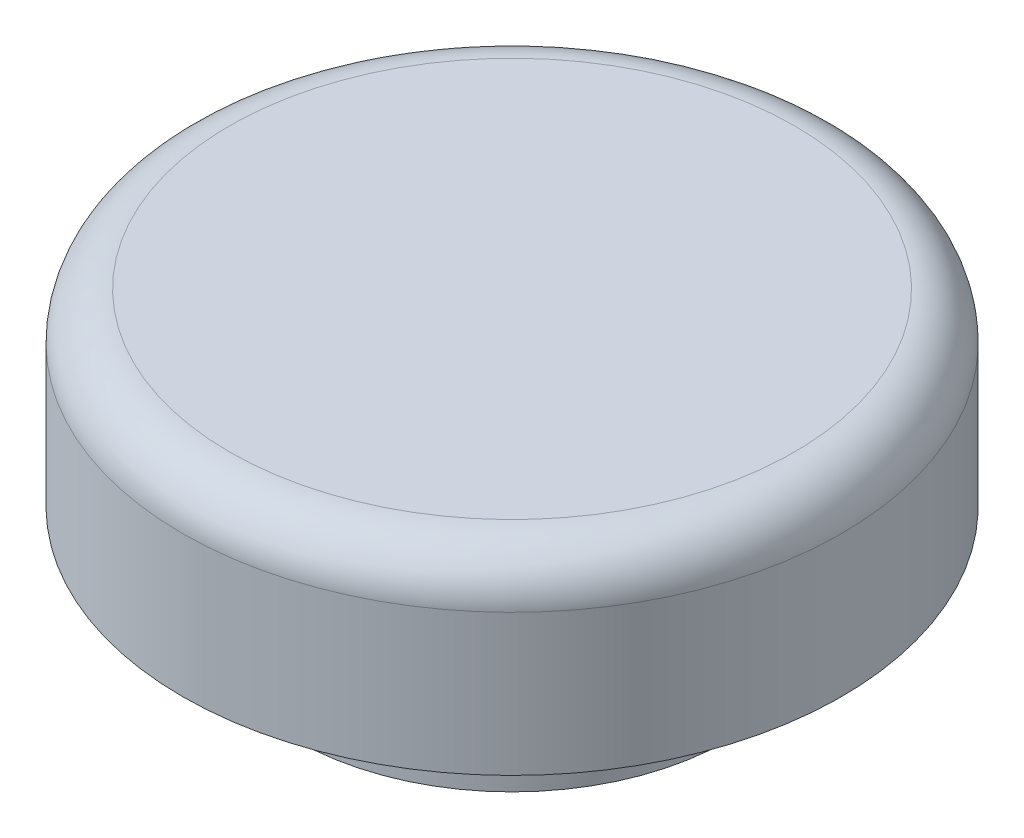
ISO-10303-21;
HEADER;
FILE_DESCRIPTION(('STEP AP214'),'2;1');
FILE_NAME('part.step','',(''),(''),'','','');
FILE_SCHEMA(('AUTOMOTIVE_DESIGN { 1 0 10303 214 1 1 1 1 }'));
ENDSEC;
DATA;
#1=APPLICATION_CONTEXT('core data for automotive mechanical design processes');
#2=APPLICATION_PROTOCOL_DEFINITION('international standard','automotive_design',2000,#1);
#3=PRODUCT_CONTEXT('',#1,'mechanical');
#4=PRODUCT('Part','Part','',(#3));
#5=PRODUCT_RELATED_PRODUCT_CATEGORY('part','',(#4));
#6=PRODUCT_DEFINITION_FORMATION('','',#4);
#7=PRODUCT_DEFINITION_CONTEXT('part definition',#1,'design');
#8=PRODUCT_DEFINITION('design','',#6,#7);
#9=PRODUCT_DEFINITION_SHAPE('','',#8);
#10=(LENGTH_UNIT() NAMED_UNIT(*) SI_UNIT(.MILLI.,.METRE.));
#11=(NAMED_UNIT(*) PLANE_ANGLE_UNIT() SI_UNIT($,.RADIAN.));
#12=(NAMED_UNIT(*) SI_UNIT($,.STERADIAN.) SOLID_ANGLE_UNIT());
#13=UNCERTAINTY_MEASURE_WITH_UNIT(LENGTH_MEASURE(1.E-05),#10,'distance_accuracy_value','');
#14=(GEOMETRIC_REPRESENTATION_CONTEXT(3) GLOBAL_UNCERTAINTY_ASSIGNED_CONTEXT((#13)) GLOBAL_UNIT_ASSIGNED_CONTEXT((#10,
#11,#12)) REPRESENTATION_CONTEXT('',''));
#15=CARTESIAN_POINT('',(0.,0.,0.));
#16=DIRECTION('',(0.,0.,1.));
#17=DIRECTION('',(1.,0.,0.));
#18=AXIS2_PLACEMENT_3D('',#15,#16,#17);
#19=CARTESIAN_POINT('',(0.,1.,0.));
#20=DIRECTION('',(0.,-1.,0.));
#21=DIRECTION('',(0.,0.,-1.));
#22=AXIS2_PLACEMENT_3D('',#19,#20,#21);
#23=CYLINDRICAL_SURFACE('',#22,2.3);
#24=CARTESIAN_POINT('',(0.,1.,0.));
#25=DIRECTION('',(0.,1.,0.));
#26=DIRECTION('',(0.,0.,1.));
#27=AXIS2_PLACEMENT_3D('',#24,#25,#26);
#28=CIRCLE('',#27,2.3);
#29=CARTESIAN_POINT('',(0.,1.,2.3));
#30=VERTEX_POINT('',#29);
#31=EDGE_CURVE('E44',#30,#30,#28,.T.);
#32=ORIENTED_EDGE('',*,*,#31,.F.);
#33=EDGE_LOOP('',(#32));
#34=FACE_BOUND('',#33,.T.);
#35=CARTESIAN_POINT('',(0.,0.,0.));
#36=DIRECTION('',(0.,1.,0.));
#37=DIRECTION('',(0.,0.,1.));
#38=AXIS2_PLACEMENT_3D('',#35,#36,#37);
#39=CIRCLE('',#38,2.3);
#40=CARTESIAN_POINT('',(0.,0.,2.3));
#41=VERTEX_POINT('',#40);
#42=EDGE_CURVE('E48',#41,#41,#39,.T.);
#43=ORIENTED_EDGE('',*,*,#42,.T.);
#44=EDGE_LOOP('',(#43));
#45=FACE_BOUND('',#44,.T.);
#46=ADVANCED_FACE('F33',(#34,#45),#23,.T.);
#47=CARTESIAN_POINT('',(0.,0.,0.));
#48=DIRECTION('',(0.,1.,0.));
#49=DIRECTION('',(0.,0.,1.));
#50=AXIS2_PLACEMENT_3D('',#47,#48,#49);
#51=PLANE('',#50);
#52=ORIENTED_EDGE('',*,*,#42,.F.);
#53=EDGE_LOOP('',(#52));
#54=FACE_BOUND('',#53,.T.);
#55=ADVANCED_FACE('F72',(#54),#51,.F.);
#56=CARTESIAN_POINT('',(0.,3.,0.));
#57=DIRECTION('',(0.,-1.,0.));
#58=DIRECTION('',(0.,0.,-1.));
#59=AXIS2_PLACEMENT_3D('',#56,#57,#58);
#60=CYLINDRICAL_SURFACE('',#59,3.5);
#61=CARTESIAN_POINT('',(0.,2.5,0.));
#62=DIRECTION('',(0.,1.,0.));
#63=DIRECTION('',(0.,0.,1.));
#64=AXIS2_PLACEMENT_3D('',#61,#62,#63);
#65=CIRCLE('',#64,3.5);
#66=CARTESIAN_POINT('',(0.,2.5,3.5));
#67=VERTEX_POINT('',#66);
#68=EDGE_CURVE('E10',#67,#67,#65,.F.);
#69=ORIENTED_EDGE('',*,*,#68,.T.);
#70=EDGE_LOOP('',(#69));
#71=FACE_BOUND('',#70,.T.);
#72=CARTESIAN_POINT('',(0.,1.,0.));
#73=DIRECTION('',(0.,1.,0.));
#74=DIRECTION('',(0.,0.,1.));
#75=AXIS2_PLACEMENT_3D('',#72,#73,#74);
#76=CIRCLE('',#75,3.5);
#77=CARTESIAN_POINT('',(0.,1.,3.5));
#78=VERTEX_POINT('',#77);
#79=EDGE_CURVE('E52',#78,#78,#76,.T.);
#80=ORIENTED_EDGE('',*,*,#79,.T.);
#81=EDGE_LOOP('',(#80));
#82=FACE_BOUND('',#81,.T.);
#83=ADVANCED_FACE('F57',(#71,#82),#60,.T.);
#84=CARTESIAN_POINT('',(0.,3.,0.));
#85=DIRECTION('',(0.,1.,0.));
#86=DIRECTION('',(0.,0.,1.));
#87=AXIS2_PLACEMENT_3D('',#84,#85,#86);
#88=PLANE('',#87);
#89=CARTESIAN_POINT('',(0.,3.,0.));
#90=DIRECTION('',(0.,1.,0.));
#91=DIRECTION('',(0.,0.,1.));
#92=AXIS2_PLACEMENT_3D('',#89,#90,#91);
#93=CIRCLE('',#92,3.);
#94=CARTESIAN_POINT('',(0.,3.,3.));
#95=VERTEX_POINT('',#94);
#96=EDGE_CURVE('E40',#95,#95,#93,.T.);
#97=ORIENTED_EDGE('',*,*,#96,.T.);
#98=EDGE_LOOP('',(#97));
#99=FACE_BOUND('',#98,.T.);
#100=ADVANCED_FACE('F61',(#99),#88,.T.);
#101=CARTESIAN_POINT('',(0.,1.,0.));
#102=DIRECTION('',(0.,1.,0.));
#103=DIRECTION('',(0.,0.,1.));
#104=AXIS2_PLACEMENT_3D('',#101,#102,#103);
#105=PLANE('',#104);
#106=ORIENTED_EDGE('',*,*,#31,.T.);
#107=EDGE_LOOP('',(#106));
#108=FACE_BOUND('',#107,.T.);
#109=ORIENTED_EDGE('',*,*,#79,.F.);
#110=EDGE_LOOP('',(#109));
#111=FACE_BOUND('',#110,.T.);
#112=ADVANCED_FACE('F59',(#108,#111),#105,.F.);
#113=CARTESIAN_POINT('',(0.,2.5,0.));
#114=DIRECTION('',(0.,1.,0.));
#115=DIRECTION('',(0.,0.,1.));
#116=AXIS2_PLACEMENT_3D('',#113,#114,#115);
#117=TOROIDAL_SURFACE('',#116,3.,0.5);
#118=ORIENTED_EDGE('',*,*,#68,.F.);
#119=EDGE_LOOP('',(#118));
#120=FACE_BOUND('',#119,.T.);
#121=ORIENTED_EDGE('',*,*,#96,.F.);
#122=EDGE_LOOP('',(#121));
#123=FACE_BOUND('',#122,.T.);
#124=ADVANCED_FACE('F35',(#120,#123),#117,.T.);
#125=CLOSED_SHELL('',(#46,#55,#83,#100,#112,#124));
#126=MANIFOLD_SOLID_BREP('B2',#125);
#127=ADVANCED_BREP_SHAPE_REPRESENTATION('',(#18,#126),#14);
#128=SHAPE_DEFINITION_REPRESENTATION(#9,#127);
ENDSEC;
END-ISO-10303-21;
